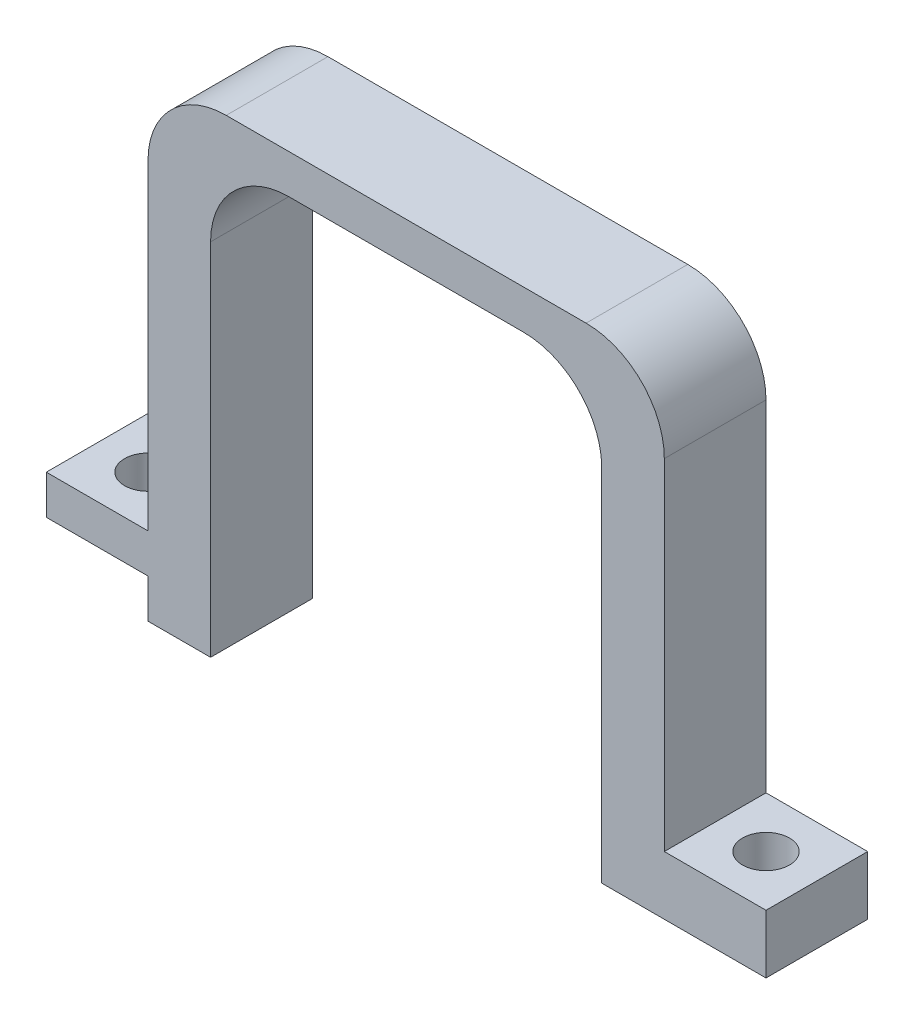
ISO-10303-21;
HEADER;
FILE_DESCRIPTION(('STEP AP214'),'2;1');
FILE_NAME('part.step','',(''),(''),'','','');
FILE_SCHEMA(('AUTOMOTIVE_DESIGN { 1 0 10303 214 1 1 1 1 }'));
ENDSEC;
DATA;
#1=APPLICATION_CONTEXT('core data for automotive mechanical design processes');
#2=APPLICATION_PROTOCOL_DEFINITION('international standard','automotive_design',2000,#1);
#3=PRODUCT_CONTEXT('',#1,'mechanical');
#4=PRODUCT('Part','Part','',(#3));
#5=PRODUCT_RELATED_PRODUCT_CATEGORY('part','',(#4));
#6=PRODUCT_DEFINITION_FORMATION('','',#4);
#7=PRODUCT_DEFINITION_CONTEXT('part definition',#1,'design');
#8=PRODUCT_DEFINITION('design','',#6,#7);
#9=PRODUCT_DEFINITION_SHAPE('','',#8);
#10=(LENGTH_UNIT() NAMED_UNIT(*) SI_UNIT(.MILLI.,.METRE.));
#11=(NAMED_UNIT(*) PLANE_ANGLE_UNIT() SI_UNIT($,.RADIAN.));
#12=(NAMED_UNIT(*) SI_UNIT($,.STERADIAN.) SOLID_ANGLE_UNIT());
#13=UNCERTAINTY_MEASURE_WITH_UNIT(LENGTH_MEASURE(1.E-05),#10,'distance_accuracy_value','');
#14=(GEOMETRIC_REPRESENTATION_CONTEXT(3) GLOBAL_UNCERTAINTY_ASSIGNED_CONTEXT((#13)) GLOBAL_UNIT_ASSIGNED_CONTEXT((#10,
#11,#12)) REPRESENTATION_CONTEXT('',''));
#15=CARTESIAN_POINT('',(0.,0.,0.));
#16=DIRECTION('',(0.,0.,1.));
#17=DIRECTION('',(1.,0.,0.));
#18=AXIS2_PLACEMENT_3D('',#15,#16,#17);
#19=CARTESIAN_POINT('',(0.,0.,2.6));
#20=DIRECTION('',(0.,0.,1.));
#21=DIRECTION('',(1.,0.,0.));
#22=AXIS2_PLACEMENT_3D('',#19,#20,#21);
#23=PLANE('',#22);
#24=DIRECTION('',(0.,-1.,0.));
#25=VECTOR('',#24,1.);
#26=CARTESIAN_POINT('',(-9.19999999999999,-4.1,2.6));
#27=LINE('',#26,#25);
#28=CARTESIAN_POINT('',(-9.19999999999999,-4.1,2.6));
#29=VERTEX_POINT('',#28);
#30=CARTESIAN_POINT('',(-9.19999999999999,-5.1,2.6));
#31=VERTEX_POINT('',#30);
#32=EDGE_CURVE('E270',#29,#31,#27,.T.);
#33=ORIENTED_EDGE('',*,*,#32,.T.);
#34=DIRECTION('',(1.,0.,0.));
#35=VECTOR('',#34,1.);
#36=CARTESIAN_POINT('',(0.,-5.1,2.6));
#37=LINE('',#36,#35);
#38=CARTESIAN_POINT('',(-6.6,-5.1,2.6));
#39=VERTEX_POINT('',#38);
#40=EDGE_CURVE('E77',#31,#39,#37,.T.);
#41=ORIENTED_EDGE('',*,*,#40,.T.);
#42=DIRECTION('',(0.,1.,0.));
#43=VECTOR('',#42,1.);
#44=CARTESIAN_POINT('',(-6.6,0.,2.6));
#45=LINE('',#44,#43);
#46=CARTESIAN_POINT('',(-6.6,-6.1,2.6));
#47=VERTEX_POINT('',#46);
#48=EDGE_CURVE('E330',#47,#39,#45,.T.);
#49=ORIENTED_EDGE('',*,*,#48,.F.);
#50=DIRECTION('',(1.,0.,0.));
#51=VECTOR('',#50,1.);
#52=CARTESIAN_POINT('',(-6.6,-6.1,2.6));
#53=LINE('',#52,#51);
#54=CARTESIAN_POINT('',(-5.,-6.1,2.6));
#55=VERTEX_POINT('',#54);
#56=EDGE_CURVE('E205',#47,#55,#53,.T.);
#57=ORIENTED_EDGE('',*,*,#56,.T.);
#58=DIRECTION('',(0.,-1.,0.));
#59=VECTOR('',#58,1.);
#60=CARTESIAN_POINT('',(-5.,5.1,2.6));
#61=LINE('',#60,#59);
#62=CARTESIAN_POINT('',(-5.,3.1,2.6));
#63=VERTEX_POINT('',#62);
#64=EDGE_CURVE('E285',#63,#55,#61,.T.);
#65=ORIENTED_EDGE('',*,*,#64,.F.);
#66=CARTESIAN_POINT('',(-3.,3.1,2.6));
#67=DIRECTION('',(0.,0.,1.));
#68=DIRECTION('',(1.,0.,0.));
#69=AXIS2_PLACEMENT_3D('',#66,#67,#68);
#70=CIRCLE('',#69,2.);
#71=CARTESIAN_POINT('',(-3.,5.1,2.6));
#72=VERTEX_POINT('',#71);
#73=EDGE_CURVE('E254',#63,#72,#70,.F.);
#74=ORIENTED_EDGE('',*,*,#73,.T.);
#75=DIRECTION('',(1.,0.,0.));
#76=VECTOR('',#75,1.);
#77=CARTESIAN_POINT('',(-5.,5.1,2.6));
#78=LINE('',#77,#76);
#79=CARTESIAN_POINT('',(3.,5.1,2.6));
#80=VERTEX_POINT('',#79);
#81=EDGE_CURVE('E279',#72,#80,#78,.T.);
#82=ORIENTED_EDGE('',*,*,#81,.T.);
#83=CARTESIAN_POINT('',(3.,3.1,2.6));
#84=DIRECTION('',(0.,0.,1.));
#85=DIRECTION('',(1.,0.,0.));
#86=AXIS2_PLACEMENT_3D('',#83,#84,#85);
#87=CIRCLE('',#86,2.);
#88=CARTESIAN_POINT('',(5.,3.1,2.6));
#89=VERTEX_POINT('',#88);
#90=EDGE_CURVE('E12',#80,#89,#87,.F.);
#91=ORIENTED_EDGE('',*,*,#90,.T.);
#92=DIRECTION('',(0.,-1.,0.));
#93=VECTOR('',#92,1.);
#94=CARTESIAN_POINT('',(5.,5.1,2.6));
#95=LINE('',#94,#93);
#96=CARTESIAN_POINT('',(5.,-6.1,2.6));
#97=VERTEX_POINT('',#96);
#98=EDGE_CURVE('E277',#89,#97,#95,.T.);
#99=ORIENTED_EDGE('',*,*,#98,.T.);
#100=CARTESIAN_POINT('',(9.2,-6.1,2.6));
#101=VERTEX_POINT('',#100);
#102=EDGE_CURVE('E299',#97,#101,#53,.T.);
#103=ORIENTED_EDGE('',*,*,#102,.T.);
#104=DIRECTION('',(0.,-1.,0.));
#105=VECTOR('',#104,1.);
#106=CARTESIAN_POINT('',(9.2,-4.1,2.6));
#107=LINE('',#106,#105);
#108=CARTESIAN_POINT('',(9.2,-4.6,2.6));
#109=VERTEX_POINT('',#108);
#110=EDGE_CURVE('E345',#109,#101,#107,.T.);
#111=ORIENTED_EDGE('',*,*,#110,.F.);
#112=DIRECTION('',(1.,0.,0.));
#113=VECTOR('',#112,1.);
#114=CARTESIAN_POINT('',(6.6,-4.6,2.6));
#115=LINE('',#114,#113);
#116=CARTESIAN_POINT('',(6.6,-4.6,2.6));
#117=VERTEX_POINT('',#116);
#118=EDGE_CURVE('E328',#117,#109,#115,.T.);
#119=ORIENTED_EDGE('',*,*,#118,.F.);
#120=DIRECTION('',(0.,-1.,0.));
#121=VECTOR('',#120,1.);
#122=CARTESIAN_POINT('',(6.6,6.1,2.6));
#123=LINE('',#122,#121);
#124=CARTESIAN_POINT('',(6.6,4.1,2.6));
#125=VERTEX_POINT('',#124);
#126=EDGE_CURVE('E301',#125,#117,#123,.T.);
#127=ORIENTED_EDGE('',*,*,#126,.F.);
#128=CARTESIAN_POINT('',(4.6,4.1,2.6));
#129=DIRECTION('',(0.,0.,1.));
#130=DIRECTION('',(1.,0.,0.));
#131=AXIS2_PLACEMENT_3D('',#128,#129,#130);
#132=CIRCLE('',#131,2.);
#133=CARTESIAN_POINT('',(4.6,6.1,2.6));
#134=VERTEX_POINT('',#133);
#135=EDGE_CURVE('E237',#125,#134,#132,.T.);
#136=ORIENTED_EDGE('',*,*,#135,.T.);
#137=DIRECTION('',(1.,0.,0.));
#138=VECTOR('',#137,1.);
#139=CARTESIAN_POINT('',(-6.6,6.1,2.6));
#140=LINE('',#139,#138);
#141=CARTESIAN_POINT('',(-4.6,6.1,2.6));
#142=VERTEX_POINT('',#141);
#143=EDGE_CURVE('E228',#142,#134,#140,.T.);
#144=ORIENTED_EDGE('',*,*,#143,.F.);
#145=CARTESIAN_POINT('',(-4.6,4.1,2.6));
#146=DIRECTION('',(0.,0.,1.));
#147=DIRECTION('',(1.,0.,0.));
#148=AXIS2_PLACEMENT_3D('',#145,#146,#147);
#149=CIRCLE('',#148,2.);
#150=CARTESIAN_POINT('',(-6.6,4.1,2.6));
#151=VERTEX_POINT('',#150);
#152=EDGE_CURVE('E239',#142,#151,#149,.T.);
#153=ORIENTED_EDGE('',*,*,#152,.T.);
#154=DIRECTION('',(0.,-1.,0.));
#155=VECTOR('',#154,1.);
#156=CARTESIAN_POINT('',(-6.6,6.1,2.6));
#157=LINE('',#156,#155);
#158=CARTESIAN_POINT('',(-6.6,-4.1,2.6));
#159=VERTEX_POINT('',#158);
#160=EDGE_CURVE('E223',#151,#159,#157,.T.);
#161=ORIENTED_EDGE('',*,*,#160,.T.);
#162=DIRECTION('',(-1.,0.,0.));
#163=VECTOR('',#162,1.);
#164=CARTESIAN_POINT('',(0.,-4.1,2.6));
#165=LINE('',#164,#163);
#166=EDGE_CURVE('E357',#159,#29,#165,.T.);
#167=ORIENTED_EDGE('',*,*,#166,.T.);
#168=EDGE_LOOP('',(#33,#41,#49,#57,#65,#74,#82,#91,#99,#103,#111,#119,#127,#136,#144,#153,#161,#167));
#169=FACE_BOUND('',#168,.T.);
#170=ADVANCED_FACE('F61',(#169),#23,.T.);
#171=CARTESIAN_POINT('',(0.,0.,0.));
#172=DIRECTION('',(0.,0.,1.));
#173=DIRECTION('',(1.,0.,0.));
#174=AXIS2_PLACEMENT_3D('',#171,#172,#173);
#175=PLANE('',#174);
#176=DIRECTION('',(1.,0.,0.));
#177=VECTOR('',#176,1.);
#178=CARTESIAN_POINT('',(0.,-5.1,0.));
#179=LINE('',#178,#177);
#180=CARTESIAN_POINT('',(-9.19999999999999,-5.1,0.));
#181=VERTEX_POINT('',#180);
#182=CARTESIAN_POINT('',(-6.6,-5.1,0.));
#183=VERTEX_POINT('',#182);
#184=EDGE_CURVE('E197',#181,#183,#179,.T.);
#185=ORIENTED_EDGE('',*,*,#184,.F.);
#186=DIRECTION('',(0.,-1.,0.));
#187=VECTOR('',#186,1.);
#188=CARTESIAN_POINT('',(-9.19999999999999,-4.1,0.));
#189=LINE('',#188,#187);
#190=CARTESIAN_POINT('',(-9.19999999999999,-4.1,0.));
#191=VERTEX_POINT('',#190);
#192=EDGE_CURVE('E360',#191,#181,#189,.T.);
#193=ORIENTED_EDGE('',*,*,#192,.F.);
#194=DIRECTION('',(-1.,0.,0.));
#195=VECTOR('',#194,1.);
#196=CARTESIAN_POINT('',(0.,-4.1,0.));
#197=LINE('',#196,#195);
#198=CARTESIAN_POINT('',(-6.6,-4.1,0.));
#199=VERTEX_POINT('',#198);
#200=EDGE_CURVE('E353',#199,#191,#197,.T.);
#201=ORIENTED_EDGE('',*,*,#200,.F.);
#202=DIRECTION('',(0.,-1.,0.));
#203=VECTOR('',#202,1.);
#204=CARTESIAN_POINT('',(-6.6,6.1,0.));
#205=LINE('',#204,#203);
#206=CARTESIAN_POINT('',(-6.6,4.1,0.));
#207=VERTEX_POINT('',#206);
#208=EDGE_CURVE('E217',#207,#199,#205,.T.);
#209=ORIENTED_EDGE('',*,*,#208,.F.);
#210=CARTESIAN_POINT('',(-4.6,4.1,0.));
#211=DIRECTION('',(0.,0.,1.));
#212=DIRECTION('',(1.,0.,0.));
#213=AXIS2_PLACEMENT_3D('',#210,#211,#212);
#214=CIRCLE('',#213,2.);
#215=CARTESIAN_POINT('',(-4.6,6.1,0.));
#216=VERTEX_POINT('',#215);
#217=EDGE_CURVE('E230',#207,#216,#214,.F.);
#218=ORIENTED_EDGE('',*,*,#217,.T.);
#219=DIRECTION('',(1.,0.,0.));
#220=VECTOR('',#219,1.);
#221=CARTESIAN_POINT('',(-6.6,6.1,0.));
#222=LINE('',#221,#220);
#223=CARTESIAN_POINT('',(4.6,6.1,0.));
#224=VERTEX_POINT('',#223);
#225=EDGE_CURVE('E214',#216,#224,#222,.T.);
#226=ORIENTED_EDGE('',*,*,#225,.T.);
#227=CARTESIAN_POINT('',(4.6,4.1,0.));
#228=DIRECTION('',(0.,0.,1.));
#229=DIRECTION('',(1.,0.,0.));
#230=AXIS2_PLACEMENT_3D('',#227,#228,#229);
#231=CIRCLE('',#230,2.);
#232=CARTESIAN_POINT('',(6.6,4.1,0.));
#233=VERTEX_POINT('',#232);
#234=EDGE_CURVE('E227',#224,#233,#231,.F.);
#235=ORIENTED_EDGE('',*,*,#234,.T.);
#236=DIRECTION('',(0.,-1.,0.));
#237=VECTOR('',#236,1.);
#238=CARTESIAN_POINT('',(6.6,6.1,0.));
#239=LINE('',#238,#237);
#240=CARTESIAN_POINT('',(6.6,-4.6,0.));
#241=VERTEX_POINT('',#240);
#242=EDGE_CURVE('E211',#233,#241,#239,.T.);
#243=ORIENTED_EDGE('',*,*,#242,.T.);
#244=DIRECTION('',(1.,0.,0.));
#245=VECTOR('',#244,1.);
#246=CARTESIAN_POINT('',(6.6,-4.6,0.));
#247=LINE('',#246,#245);
#248=CARTESIAN_POINT('',(9.2,-4.6,0.));
#249=VERTEX_POINT('',#248);
#250=EDGE_CURVE('E321',#241,#249,#247,.T.);
#251=ORIENTED_EDGE('',*,*,#250,.T.);
#252=DIRECTION('',(0.,-1.,0.));
#253=VECTOR('',#252,1.);
#254=CARTESIAN_POINT('',(9.2,-4.1,0.));
#255=LINE('',#254,#253);
#256=CARTESIAN_POINT('',(9.2,-6.1,0.));
#257=VERTEX_POINT('',#256);
#258=EDGE_CURVE('E344',#249,#257,#255,.T.);
#259=ORIENTED_EDGE('',*,*,#258,.T.);
#260=DIRECTION('',(1.,0.,0.));
#261=VECTOR('',#260,1.);
#262=CARTESIAN_POINT('',(-6.6,-6.1,0.));
#263=LINE('',#262,#261);
#264=CARTESIAN_POINT('',(5.,-6.1,0.));
#265=VERTEX_POINT('',#264);
#266=EDGE_CURVE('E212',#265,#257,#263,.T.);
#267=ORIENTED_EDGE('',*,*,#266,.F.);
#268=DIRECTION('',(0.,-1.,0.));
#269=VECTOR('',#268,1.);
#270=CARTESIAN_POINT('',(5.,5.1,0.));
#271=LINE('',#270,#269);
#272=CARTESIAN_POINT('',(5.,3.1,0.));
#273=VERTEX_POINT('',#272);
#274=EDGE_CURVE('E261',#273,#265,#271,.T.);
#275=ORIENTED_EDGE('',*,*,#274,.F.);
#276=CARTESIAN_POINT('',(3.,3.1,0.));
#277=DIRECTION('',(0.,0.,1.));
#278=DIRECTION('',(1.,0.,0.));
#279=AXIS2_PLACEMENT_3D('',#276,#277,#278);
#280=CIRCLE('',#279,2.);
#281=CARTESIAN_POINT('',(3.,5.1,0.));
#282=VERTEX_POINT('',#281);
#283=EDGE_CURVE('E70',#273,#282,#280,.T.);
#284=ORIENTED_EDGE('',*,*,#283,.T.);
#285=DIRECTION('',(1.,0.,0.));
#286=VECTOR('',#285,1.);
#287=CARTESIAN_POINT('',(-5.,5.1,0.));
#288=LINE('',#287,#286);
#289=CARTESIAN_POINT('',(-3.,5.1,0.));
#290=VERTEX_POINT('',#289);
#291=EDGE_CURVE('E259',#290,#282,#288,.T.);
#292=ORIENTED_EDGE('',*,*,#291,.F.);
#293=CARTESIAN_POINT('',(-3.,3.1,0.));
#294=DIRECTION('',(0.,0.,1.));
#295=DIRECTION('',(1.,0.,0.));
#296=AXIS2_PLACEMENT_3D('',#293,#294,#295);
#297=CIRCLE('',#296,2.);
#298=CARTESIAN_POINT('',(-5.,3.1,0.));
#299=VERTEX_POINT('',#298);
#300=EDGE_CURVE('E252',#290,#299,#297,.T.);
#301=ORIENTED_EDGE('',*,*,#300,.T.);
#302=DIRECTION('',(0.,-1.,0.));
#303=VECTOR('',#302,1.);
#304=CARTESIAN_POINT('',(-5.,5.1,0.));
#305=LINE('',#304,#303);
#306=CARTESIAN_POINT('',(-5.,-6.1,0.));
#307=VERTEX_POINT('',#306);
#308=EDGE_CURVE('E209',#299,#307,#305,.T.);
#309=ORIENTED_EDGE('',*,*,#308,.T.);
#310=CARTESIAN_POINT('',(-6.6,-6.1,0.));
#311=VERTEX_POINT('',#310);
#312=EDGE_CURVE('E203',#311,#307,#263,.T.);
#313=ORIENTED_EDGE('',*,*,#312,.F.);
#314=DIRECTION('',(0.,1.,0.));
#315=VECTOR('',#314,1.);
#316=CARTESIAN_POINT('',(-6.6,0.,0.));
#317=LINE('',#316,#315);
#318=EDGE_CURVE('E187',#311,#183,#317,.T.);
#319=ORIENTED_EDGE('',*,*,#318,.T.);
#320=EDGE_LOOP('',(#185,#193,#201,#209,#218,#226,#235,#243,#251,#259,#267,#275,#284,#292,#301,
#309,#313,#319));
#321=FACE_BOUND('',#320,.T.);
#322=ADVANCED_FACE('F207',(#321),#175,.F.);
#323=CARTESIAN_POINT('',(-9.19999999999999,-4.1,0.));
#324=DIRECTION('',(1.,0.,0.));
#325=DIRECTION('',(0.,0.,-1.));
#326=AXIS2_PLACEMENT_3D('',#323,#324,#325);
#327=PLANE('',#326);
#328=DIRECTION('',(0.,0.,1.));
#329=VECTOR('',#328,1.);
#330=CARTESIAN_POINT('',(-9.19999999999999,-5.1,0.));
#331=LINE('',#330,#329);
#332=EDGE_CURVE('E337',#181,#31,#331,.T.);
#333=ORIENTED_EDGE('',*,*,#332,.T.);
#334=ORIENTED_EDGE('',*,*,#32,.F.);
#335=DIRECTION('',(0.,0.,1.));
#336=VECTOR('',#335,1.);
#337=CARTESIAN_POINT('',(-9.19999999999999,-4.1,0.));
#338=LINE('',#337,#336);
#339=EDGE_CURVE('E351',#191,#29,#338,.T.);
#340=ORIENTED_EDGE('',*,*,#339,.F.);
#341=ORIENTED_EDGE('',*,*,#192,.T.);
#342=EDGE_LOOP('',(#333,#334,#340,#341));
#343=FACE_BOUND('',#342,.T.);
#344=ADVANCED_FACE('F365',(#343),#327,.F.);
#345=CARTESIAN_POINT('',(-7.89999999999999,-4.1,1.3));
#346=DIRECTION('',(0.,-1.,0.));
#347=DIRECTION('',(0.,0.,-1.));
#348=AXIS2_PLACEMENT_3D('',#345,#346,#347);
#349=CYLINDRICAL_SURFACE('',#348,0.6);
#350=CARTESIAN_POINT('',(-7.89999999999999,-4.1,1.3));
#351=DIRECTION('',(0.,-1.,0.));
#352=DIRECTION('',(0.,0.,-1.));
#353=AXIS2_PLACEMENT_3D('',#350,#351,#352);
#354=CIRCLE('',#353,0.6);
#355=CARTESIAN_POINT('',(-7.89999999999999,-4.1,0.7));
#356=VERTEX_POINT('',#355);
#357=EDGE_CURVE('E347',#356,#356,#354,.T.);
#358=ORIENTED_EDGE('',*,*,#357,.F.);
#359=EDGE_LOOP('',(#358));
#360=FACE_BOUND('',#359,.T.);
#361=CARTESIAN_POINT('',(-7.89999999999999,-5.1,1.3));
#362=DIRECTION('',(0.,-1.,0.));
#363=DIRECTION('',(0.,0.,-1.));
#364=AXIS2_PLACEMENT_3D('',#361,#362,#363);
#365=CIRCLE('',#364,0.6);
#366=CARTESIAN_POINT('',(-7.89999999999999,-5.1,0.7));
#367=VERTEX_POINT('',#366);
#368=EDGE_CURVE('E65',#367,#367,#365,.F.);
#369=ORIENTED_EDGE('',*,*,#368,.F.);
#370=EDGE_LOOP('',(#369));
#371=FACE_BOUND('',#370,.T.);
#372=ADVANCED_FACE('F412',(#360,#371),#349,.F.);
#373=CARTESIAN_POINT('',(6.6,6.1,2.6));
#374=DIRECTION('',(1.,0.,0.));
#375=DIRECTION('',(0.,0.,-1.));
#376=AXIS2_PLACEMENT_3D('',#373,#374,#375);
#377=PLANE('',#376);
#378=ORIENTED_EDGE('',*,*,#126,.T.);
#379=DIRECTION('',(0.,0.,1.));
#380=VECTOR('',#379,1.);
#381=CARTESIAN_POINT('',(6.6,-4.6,0.));
#382=LINE('',#381,#380);
#383=EDGE_CURVE('E317',#241,#117,#382,.T.);
#384=ORIENTED_EDGE('',*,*,#383,.F.);
#385=ORIENTED_EDGE('',*,*,#242,.F.);
#386=DIRECTION('',(0.,0.,-1.));
#387=VECTOR('',#386,1.);
#388=CARTESIAN_POINT('',(6.6,4.1,2.6));
#389=LINE('',#388,#387);
#390=EDGE_CURVE('E85',#233,#125,#389,.F.);
#391=ORIENTED_EDGE('',*,*,#390,.T.);
#392=EDGE_LOOP('',(#378,#384,#385,#391));
#393=FACE_BOUND('',#392,.T.);
#394=ADVANCED_FACE('F315',(#393),#377,.T.);
#395=CARTESIAN_POINT('',(-6.6,6.1,2.6));
#396=DIRECTION('',(1.,0.,0.));
#397=DIRECTION('',(0.,0.,-1.));
#398=AXIS2_PLACEMENT_3D('',#395,#396,#397);
#399=PLANE('',#398);
#400=DIRECTION('',(0.,0.,-1.));
#401=VECTOR('',#400,1.);
#402=CARTESIAN_POINT('',(-6.6,-4.1,0.));
#403=LINE('',#402,#401);
#404=EDGE_CURVE('E355',#159,#199,#403,.T.);
#405=ORIENTED_EDGE('',*,*,#404,.F.);
#406=ORIENTED_EDGE('',*,*,#160,.F.);
#407=DIRECTION('',(0.,0.,-1.));
#408=VECTOR('',#407,1.);
#409=CARTESIAN_POINT('',(-6.6,4.1,0.));
#410=LINE('',#409,#408);
#411=EDGE_CURVE('E224',#151,#207,#410,.T.);
#412=ORIENTED_EDGE('',*,*,#411,.T.);
#413=ORIENTED_EDGE('',*,*,#208,.T.);
#414=EDGE_LOOP('',(#405,#406,#412,#413));
#415=FACE_BOUND('',#414,.T.);
#416=ADVANCED_FACE('F411',(#415),#399,.F.);
#417=CARTESIAN_POINT('',(-6.6,-6.1,2.6));
#418=DIRECTION('',(0.,1.,0.));
#419=DIRECTION('',(0.,0.,1.));
#420=AXIS2_PLACEMENT_3D('',#417,#418,#419);
#421=PLANE('',#420);
#422=ORIENTED_EDGE('',*,*,#56,.F.);
#423=DIRECTION('',(0.,0.,1.));
#424=VECTOR('',#423,1.);
#425=CARTESIAN_POINT('',(-6.6,-6.1,0.));
#426=LINE('',#425,#424);
#427=EDGE_CURVE('E191',#311,#47,#426,.T.);
#428=ORIENTED_EDGE('',*,*,#427,.F.);
#429=ORIENTED_EDGE('',*,*,#312,.T.);
#430=DIRECTION('',(0.,0.,-1.));
#431=VECTOR('',#430,1.);
#432=CARTESIAN_POINT('',(-5.,-6.1,2.6));
#433=LINE('',#432,#431);
#434=EDGE_CURVE('E294',#55,#307,#433,.T.);
#435=ORIENTED_EDGE('',*,*,#434,.F.);
#436=EDGE_LOOP('',(#422,#428,#429,#435));
#437=FACE_BOUND('',#436,.T.);
#438=ADVANCED_FACE('F201',(#437),#421,.F.);
#439=ORIENTED_EDGE('',*,*,#102,.F.);
#440=DIRECTION('',(0.,0.,-1.));
#441=VECTOR('',#440,1.);
#442=CARTESIAN_POINT('',(5.,-6.1,2.6));
#443=LINE('',#442,#441);
#444=EDGE_CURVE('E283',#97,#265,#443,.T.);
#445=ORIENTED_EDGE('',*,*,#444,.T.);
#446=ORIENTED_EDGE('',*,*,#266,.T.);
#447=DIRECTION('',(0.,0.,1.));
#448=VECTOR('',#447,1.);
#449=CARTESIAN_POINT('',(9.2,-6.1,0.));
#450=LINE('',#449,#448);
#451=EDGE_CURVE('E341',#257,#101,#450,.T.);
#452=ORIENTED_EDGE('',*,*,#451,.T.);
#453=EDGE_LOOP('',(#439,#445,#446,#452));
#454=FACE_BOUND('',#453,.T.);
#455=CARTESIAN_POINT('',(7.9,-6.1,1.3));
#456=DIRECTION('',(0.,-1.,0.));
#457=DIRECTION('',(0.,0.,-1.));
#458=AXIS2_PLACEMENT_3D('',#455,#456,#457);
#459=CIRCLE('',#458,0.6);
#460=CARTESIAN_POINT('',(7.9,-6.1,0.7));
#461=VERTEX_POINT('',#460);
#462=EDGE_CURVE('E338',#461,#461,#459,.T.);
#463=ORIENTED_EDGE('',*,*,#462,.F.);
#464=EDGE_LOOP('',(#463));
#465=FACE_BOUND('',#464,.T.);
#466=ADVANCED_FACE('F380',(#454,#465),#421,.F.);
#467=CARTESIAN_POINT('',(-6.6,6.1,2.6));
#468=DIRECTION('',(0.,1.,0.));
#469=DIRECTION('',(0.,0.,1.));
#470=AXIS2_PLACEMENT_3D('',#467,#468,#469);
#471=PLANE('',#470);
#472=ORIENTED_EDGE('',*,*,#225,.F.);
#473=DIRECTION('',(0.,0.,-1.));
#474=VECTOR('',#473,1.);
#475=CARTESIAN_POINT('',(-4.6,6.1,2.6));
#476=LINE('',#475,#474);
#477=EDGE_CURVE('E235',#216,#142,#476,.F.);
#478=ORIENTED_EDGE('',*,*,#477,.T.);
#479=ORIENTED_EDGE('',*,*,#143,.T.);
#480=DIRECTION('',(0.,0.,-1.));
#481=VECTOR('',#480,1.);
#482=CARTESIAN_POINT('',(4.6,6.1,2.6));
#483=LINE('',#482,#481);
#484=EDGE_CURVE('E232',#134,#224,#483,.T.);
#485=ORIENTED_EDGE('',*,*,#484,.T.);
#486=EDGE_LOOP('',(#472,#478,#479,#485));
#487=FACE_BOUND('',#486,.T.);
#488=ADVANCED_FACE('F307',(#487),#471,.T.);
#489=CARTESIAN_POINT('',(-5.,5.1,2.6));
#490=DIRECTION('',(0.,1.,0.));
#491=DIRECTION('',(-1.,0.,0.));
#492=AXIS2_PLACEMENT_3D('',#489,#490,#491);
#493=PLANE('',#492);
#494=ORIENTED_EDGE('',*,*,#81,.F.);
#495=DIRECTION('',(0.,0.,-1.));
#496=VECTOR('',#495,1.);
#497=CARTESIAN_POINT('',(-3.,5.1,2.6));
#498=LINE('',#497,#496);
#499=EDGE_CURVE('E244',#72,#290,#498,.T.);
#500=ORIENTED_EDGE('',*,*,#499,.T.);
#501=ORIENTED_EDGE('',*,*,#291,.T.);
#502=DIRECTION('',(0.,0.,-1.));
#503=VECTOR('',#502,1.);
#504=CARTESIAN_POINT('',(3.,5.1,2.6));
#505=LINE('',#504,#503);
#506=EDGE_CURVE('E242',#282,#80,#505,.F.);
#507=ORIENTED_EDGE('',*,*,#506,.T.);
#508=EDGE_LOOP('',(#494,#500,#501,#507));
#509=FACE_BOUND('',#508,.T.);
#510=ADVANCED_FACE('F267',(#509),#493,.F.);
#511=CARTESIAN_POINT('',(-5.,5.1,2.6));
#512=DIRECTION('',(1.,0.,0.));
#513=DIRECTION('',(0.,1.,0.));
#514=AXIS2_PLACEMENT_3D('',#511,#512,#513);
#515=PLANE('',#514);
#516=ORIENTED_EDGE('',*,*,#308,.F.);
#517=DIRECTION('',(0.,0.,-1.));
#518=VECTOR('',#517,1.);
#519=CARTESIAN_POINT('',(-5.,3.1,2.6));
#520=LINE('',#519,#518);
#521=EDGE_CURVE('E247',#299,#63,#520,.F.);
#522=ORIENTED_EDGE('',*,*,#521,.T.);
#523=ORIENTED_EDGE('',*,*,#64,.T.);
#524=ORIENTED_EDGE('',*,*,#434,.T.);
#525=EDGE_LOOP('',(#516,#522,#523,#524));
#526=FACE_BOUND('',#525,.T.);
#527=ADVANCED_FACE('F432',(#526),#515,.T.);
#528=CARTESIAN_POINT('',(5.,5.1,2.6));
#529=DIRECTION('',(1.,0.,0.));
#530=DIRECTION('',(0.,1.,0.));
#531=AXIS2_PLACEMENT_3D('',#528,#529,#530);
#532=PLANE('',#531);
#533=ORIENTED_EDGE('',*,*,#98,.F.);
#534=DIRECTION('',(0.,0.,-1.));
#535=VECTOR('',#534,1.);
#536=CARTESIAN_POINT('',(5.,3.1,0.));
#537=LINE('',#536,#535);
#538=EDGE_CURVE('E249',#89,#273,#537,.T.);
#539=ORIENTED_EDGE('',*,*,#538,.T.);
#540=ORIENTED_EDGE('',*,*,#274,.T.);
#541=ORIENTED_EDGE('',*,*,#444,.F.);
#542=EDGE_LOOP('',(#533,#539,#540,#541));
#543=FACE_BOUND('',#542,.T.);
#544=ADVANCED_FACE('F281',(#543),#532,.F.);
#545=CARTESIAN_POINT('',(-4.6,4.1,2.6));
#546=DIRECTION('',(0.,0.,1.));
#547=DIRECTION('',(1.,0.,0.));
#548=AXIS2_PLACEMENT_3D('',#545,#546,#547);
#549=CYLINDRICAL_SURFACE('',#548,2.);
#550=ORIENTED_EDGE('',*,*,#152,.F.);
#551=ORIENTED_EDGE('',*,*,#477,.F.);
#552=ORIENTED_EDGE('',*,*,#217,.F.);
#553=ORIENTED_EDGE('',*,*,#411,.F.);
#554=EDGE_LOOP('',(#550,#551,#552,#553));
#555=FACE_BOUND('',#554,.T.);
#556=ADVANCED_FACE('F417',(#555),#549,.T.);
#557=CARTESIAN_POINT('',(4.6,4.1,2.6));
#558=DIRECTION('',(0.,0.,-1.));
#559=DIRECTION('',(-1.,0.,0.));
#560=AXIS2_PLACEMENT_3D('',#557,#558,#559);
#561=CYLINDRICAL_SURFACE('',#560,2.);
#562=ORIENTED_EDGE('',*,*,#135,.F.);
#563=ORIENTED_EDGE('',*,*,#390,.F.);
#564=ORIENTED_EDGE('',*,*,#234,.F.);
#565=ORIENTED_EDGE('',*,*,#484,.F.);
#566=EDGE_LOOP('',(#562,#563,#564,#565));
#567=FACE_BOUND('',#566,.T.);
#568=ADVANCED_FACE('F312',(#567),#561,.T.);
#569=CARTESIAN_POINT('',(-3.,3.1,2.6));
#570=DIRECTION('',(0.,0.,-1.));
#571=DIRECTION('',(-1.,0.,0.));
#572=AXIS2_PLACEMENT_3D('',#569,#570,#571);
#573=CYLINDRICAL_SURFACE('',#572,2.);
#574=ORIENTED_EDGE('',*,*,#73,.F.);
#575=ORIENTED_EDGE('',*,*,#521,.F.);
#576=ORIENTED_EDGE('',*,*,#300,.F.);
#577=ORIENTED_EDGE('',*,*,#499,.F.);
#578=EDGE_LOOP('',(#574,#575,#576,#577));
#579=FACE_BOUND('',#578,.T.);
#580=ADVANCED_FACE('F422',(#579),#573,.F.);
#581=CARTESIAN_POINT('',(3.,3.1,2.6));
#582=DIRECTION('',(0.,0.,1.));
#583=DIRECTION('',(1.,0.,0.));
#584=AXIS2_PLACEMENT_3D('',#581,#582,#583);
#585=CYLINDRICAL_SURFACE('',#584,2.);
#586=ORIENTED_EDGE('',*,*,#90,.F.);
#587=ORIENTED_EDGE('',*,*,#506,.F.);
#588=ORIENTED_EDGE('',*,*,#283,.F.);
#589=ORIENTED_EDGE('',*,*,#538,.F.);
#590=EDGE_LOOP('',(#586,#587,#588,#589));
#591=FACE_BOUND('',#590,.T.);
#592=ADVANCED_FACE('F63',(#591),#585,.F.);
#593=CARTESIAN_POINT('',(0.,-4.1,0.));
#594=DIRECTION('',(0.,-1.,0.));
#595=DIRECTION('',(0.,0.,-1.));
#596=AXIS2_PLACEMENT_3D('',#593,#594,#595);
#597=PLANE('',#596);
#598=ORIENTED_EDGE('',*,*,#357,.T.);
#599=EDGE_LOOP('',(#598));
#600=FACE_BOUND('',#599,.T.);
#601=ORIENTED_EDGE('',*,*,#339,.T.);
#602=ORIENTED_EDGE('',*,*,#166,.F.);
#603=ORIENTED_EDGE('',*,*,#404,.T.);
#604=ORIENTED_EDGE('',*,*,#200,.T.);
#605=EDGE_LOOP('',(#601,#602,#603,#604));
#606=FACE_BOUND('',#605,.T.);
#607=ADVANCED_FACE('F388',(#600,#606),#597,.F.);
#608=CARTESIAN_POINT('',(7.9,-4.1,1.3));
#609=DIRECTION('',(0.,-1.,0.));
#610=DIRECTION('',(0.,0.,-1.));
#611=AXIS2_PLACEMENT_3D('',#608,#609,#610);
#612=CYLINDRICAL_SURFACE('',#611,0.6);
#613=CARTESIAN_POINT('',(7.9,-4.6,1.3));
#614=DIRECTION('',(0.,-1.,0.));
#615=DIRECTION('',(0.,0.,-1.));
#616=AXIS2_PLACEMENT_3D('',#613,#614,#615);
#617=CIRCLE('',#616,0.6);
#618=CARTESIAN_POINT('',(7.9,-4.6,0.7));
#619=VERTEX_POINT('',#618);
#620=EDGE_CURVE('E334',#619,#619,#617,.F.);
#621=ORIENTED_EDGE('',*,*,#620,.T.);
#622=EDGE_LOOP('',(#621));
#623=FACE_BOUND('',#622,.T.);
#624=ORIENTED_EDGE('',*,*,#462,.T.);
#625=EDGE_LOOP('',(#624));
#626=FACE_BOUND('',#625,.T.);
#627=ADVANCED_FACE('F386',(#623,#626),#612,.F.);
#628=CARTESIAN_POINT('',(9.2,-4.1,0.));
#629=DIRECTION('',(1.,0.,0.));
#630=DIRECTION('',(0.,0.,-1.));
#631=AXIS2_PLACEMENT_3D('',#628,#629,#630);
#632=PLANE('',#631);
#633=DIRECTION('',(0.,0.,1.));
#634=VECTOR('',#633,1.);
#635=CARTESIAN_POINT('',(9.2,-4.6,0.));
#636=LINE('',#635,#634);
#637=EDGE_CURVE('E322',#249,#109,#636,.T.);
#638=ORIENTED_EDGE('',*,*,#637,.T.);
#639=ORIENTED_EDGE('',*,*,#110,.T.);
#640=ORIENTED_EDGE('',*,*,#451,.F.);
#641=ORIENTED_EDGE('',*,*,#258,.F.);
#642=EDGE_LOOP('',(#638,#639,#640,#641));
#643=FACE_BOUND('',#642,.T.);
#644=ADVANCED_FACE('F377',(#643),#632,.T.);
#645=CARTESIAN_POINT('',(6.6,-4.6,0.));
#646=DIRECTION('',(0.,-1.,0.));
#647=DIRECTION('',(0.,0.,-1.));
#648=AXIS2_PLACEMENT_3D('',#645,#646,#647);
#649=PLANE('',#648);
#650=ORIENTED_EDGE('',*,*,#118,.T.);
#651=ORIENTED_EDGE('',*,*,#637,.F.);
#652=ORIENTED_EDGE('',*,*,#250,.F.);
#653=ORIENTED_EDGE('',*,*,#383,.T.);
#654=EDGE_LOOP('',(#650,#651,#652,#653));
#655=FACE_BOUND('',#654,.T.);
#656=ORIENTED_EDGE('',*,*,#620,.F.);
#657=EDGE_LOOP('',(#656));
#658=FACE_BOUND('',#657,.T.);
#659=ADVANCED_FACE('F324',(#655,#658),#649,.F.);
#660=CARTESIAN_POINT('',(0.,-5.1,0.));
#661=DIRECTION('',(0.,-1.,0.));
#662=DIRECTION('',(0.,0.,-1.));
#663=AXIS2_PLACEMENT_3D('',#660,#661,#662);
#664=PLANE('',#663);
#665=ORIENTED_EDGE('',*,*,#40,.F.);
#666=ORIENTED_EDGE('',*,*,#332,.F.);
#667=ORIENTED_EDGE('',*,*,#184,.T.);
#668=DIRECTION('',(0.,0.,1.));
#669=VECTOR('',#668,1.);
#670=CARTESIAN_POINT('',(-6.6,-5.1,0.));
#671=LINE('',#670,#669);
#672=EDGE_CURVE('E193',#183,#39,#671,.T.);
#673=ORIENTED_EDGE('',*,*,#672,.T.);
#674=EDGE_LOOP('',(#665,#666,#667,#673));
#675=FACE_BOUND('',#674,.T.);
#676=ORIENTED_EDGE('',*,*,#368,.T.);
#677=EDGE_LOOP('',(#676));
#678=FACE_BOUND('',#677,.T.);
#679=ADVANCED_FACE('F518',(#675,#678),#664,.T.);
#680=CARTESIAN_POINT('',(-6.6,0.,0.));
#681=DIRECTION('',(1.,0.,0.));
#682=DIRECTION('',(0.,0.,-1.));
#683=AXIS2_PLACEMENT_3D('',#680,#681,#682);
#684=PLANE('',#683);
#685=ORIENTED_EDGE('',*,*,#48,.T.);
#686=ORIENTED_EDGE('',*,*,#672,.F.);
#687=ORIENTED_EDGE('',*,*,#318,.F.);
#688=ORIENTED_EDGE('',*,*,#427,.T.);
#689=EDGE_LOOP('',(#685,#686,#687,#688));
#690=FACE_BOUND('',#689,.T.);
#691=ADVANCED_FACE('F190',(#690),#684,.F.);
#692=CLOSED_SHELL('',(#170,#322,#344,#372,#394,#416,#438,#466,#488,#510,#527,#544,#556,#568,
#580,#592,#607,#627,#644,#659,#679,#691));
#693=MANIFOLD_SOLID_BREP('B2',#692);
#694=ADVANCED_BREP_SHAPE_REPRESENTATION('',(#18,#693),#14);
#695=SHAPE_DEFINITION_REPRESENTATION(#9,#694);
ENDSEC;
END-ISO-10303-21;
